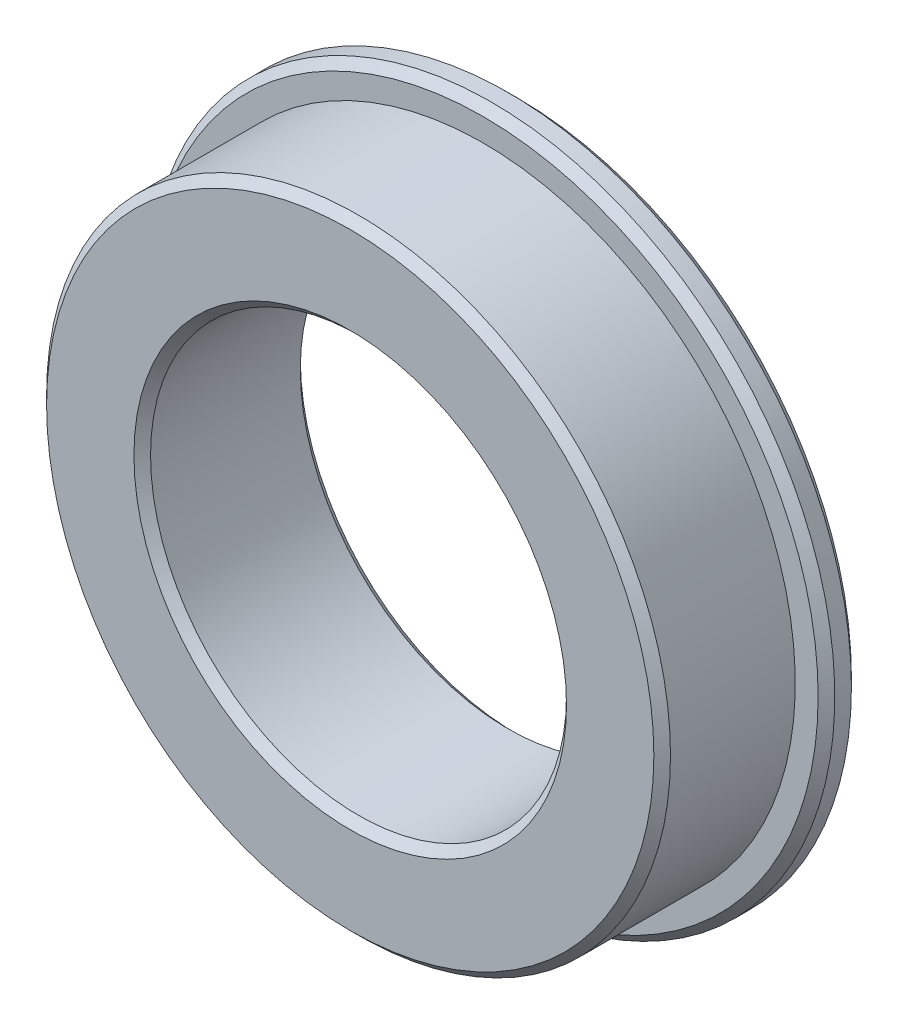
ISO-10303-21;
HEADER;
FILE_DESCRIPTION(('STEP AP214'),'2;1');
FILE_NAME('part.step','',(''),(''),'','','');
FILE_SCHEMA(('AUTOMOTIVE_DESIGN { 1 0 10303 214 1 1 1 1 }'));
ENDSEC;
DATA;
#1=APPLICATION_CONTEXT('core data for automotive mechanical design processes');
#2=APPLICATION_PROTOCOL_DEFINITION('international standard','automotive_design',2000,#1);
#3=PRODUCT_CONTEXT('',#1,'mechanical');
#4=PRODUCT('Part','Part','',(#3));
#5=PRODUCT_RELATED_PRODUCT_CATEGORY('part','',(#4));
#6=PRODUCT_DEFINITION_FORMATION('','',#4);
#7=PRODUCT_DEFINITION_CONTEXT('part definition',#1,'design');
#8=PRODUCT_DEFINITION('design','',#6,#7);
#9=PRODUCT_DEFINITION_SHAPE('','',#8);
#10=(LENGTH_UNIT() NAMED_UNIT(*) SI_UNIT(.MILLI.,.METRE.));
#11=(NAMED_UNIT(*) PLANE_ANGLE_UNIT() SI_UNIT($,.RADIAN.));
#12=(NAMED_UNIT(*) SI_UNIT($,.STERADIAN.) SOLID_ANGLE_UNIT());
#13=UNCERTAINTY_MEASURE_WITH_UNIT(LENGTH_MEASURE(1.E-05),#10,'distance_accuracy_value','');
#14=(GEOMETRIC_REPRESENTATION_CONTEXT(3) GLOBAL_UNCERTAINTY_ASSIGNED_CONTEXT((#13)) GLOBAL_UNIT_ASSIGNED_CONTEXT((#10,
#11,#12)) REPRESENTATION_CONTEXT('',''));
#15=CARTESIAN_POINT('',(0.,0.,0.));
#16=DIRECTION('',(0.,0.,1.));
#17=DIRECTION('',(1.,0.,0.));
#18=AXIS2_PLACEMENT_3D('',#15,#16,#17);
#19=CARTESIAN_POINT('',(0.,0.,4.));
#20=DIRECTION('',(0.,0.,-1.));
#21=DIRECTION('',(-1.,0.,0.));
#22=AXIS2_PLACEMENT_3D('',#19,#20,#21);
#23=CYLINDRICAL_SURFACE('',#22,7.5);
#24=CARTESIAN_POINT('',(0.,0.,3.8));
#25=DIRECTION('',(0.,0.,1.));
#26=DIRECTION('',(1.,0.,0.));
#27=AXIS2_PLACEMENT_3D('',#24,#25,#26);
#28=CIRCLE('',#27,7.5);
#29=CARTESIAN_POINT('',(7.5,0.,3.8));
#30=VERTEX_POINT('',#29);
#31=EDGE_CURVE('E41',#30,#30,#28,.F.);
#32=ORIENTED_EDGE('',*,*,#31,.T.);
#33=EDGE_LOOP('',(#32));
#34=FACE_BOUND('',#33,.T.);
#35=CARTESIAN_POINT('',(0.,0.,0.8));
#36=DIRECTION('',(0.,0.,-1.));
#37=DIRECTION('',(-1.,0.,0.));
#38=AXIS2_PLACEMENT_3D('',#35,#36,#37);
#39=CIRCLE('',#38,7.5);
#40=CARTESIAN_POINT('',(-7.5,0.,0.8));
#41=VERTEX_POINT('',#40);
#42=EDGE_CURVE('E72',#41,#41,#39,.T.);
#43=ORIENTED_EDGE('',*,*,#42,.F.);
#44=EDGE_LOOP('',(#43));
#45=FACE_BOUND('',#44,.T.);
#46=ADVANCED_FACE('F33',(#34,#45),#23,.T.);
#47=CARTESIAN_POINT('',(0.,0.,4.));
#48=DIRECTION('',(0.,0.,1.));
#49=DIRECTION('',(1.,0.,0.));
#50=AXIS2_PLACEMENT_3D('',#47,#48,#49);
#51=PLANE('',#50);
#52=CARTESIAN_POINT('',(0.,0.,4.));
#53=DIRECTION('',(0.,0.,1.));
#54=DIRECTION('',(1.,0.,0.));
#55=AXIS2_PLACEMENT_3D('',#52,#53,#54);
#56=CIRCLE('',#55,5.19999999999999);
#57=CARTESIAN_POINT('',(5.19999999999999,0.,4.));
#58=VERTEX_POINT('',#57);
#59=EDGE_CURVE('E60',#58,#58,#56,.F.);
#60=ORIENTED_EDGE('',*,*,#59,.T.);
#61=EDGE_LOOP('',(#60));
#62=FACE_BOUND('',#61,.T.);
#63=CARTESIAN_POINT('',(0.,0.,4.));
#64=DIRECTION('',(0.,0.,1.));
#65=DIRECTION('',(1.,0.,0.));
#66=AXIS2_PLACEMENT_3D('',#63,#64,#65);
#67=CIRCLE('',#66,7.3);
#68=CARTESIAN_POINT('',(7.3,0.,4.));
#69=VERTEX_POINT('',#68);
#70=EDGE_CURVE('E63',#69,#69,#67,.T.);
#71=ORIENTED_EDGE('',*,*,#70,.T.);
#72=EDGE_LOOP('',(#71));
#73=FACE_BOUND('',#72,.T.);
#74=ADVANCED_FACE('F79',(#62,#73),#51,.T.);
#75=CARTESIAN_POINT('',(0.,0.,0.));
#76=DIRECTION('',(0.,0.,1.));
#77=DIRECTION('',(1.,0.,0.));
#78=AXIS2_PLACEMENT_3D('',#75,#76,#77);
#79=PLANE('',#78);
#80=CARTESIAN_POINT('',(0.,0.,0.));
#81=DIRECTION('',(0.,0.,1.));
#82=DIRECTION('',(1.,0.,0.));
#83=AXIS2_PLACEMENT_3D('',#80,#81,#82);
#84=CIRCLE('',#83,5.19999999999999);
#85=CARTESIAN_POINT('',(-5.19999999999999,0.,0.));
#86=VERTEX_POINT('',#85);
#87=EDGE_CURVE('E54',#86,#86,#84,.T.);
#88=ORIENTED_EDGE('',*,*,#87,.T.);
#89=EDGE_LOOP('',(#88));
#90=FACE_BOUND('',#89,.T.);
#91=CARTESIAN_POINT('',(0.,0.,0.));
#92=DIRECTION('',(0.,0.,1.));
#93=DIRECTION('',(1.,0.,0.));
#94=AXIS2_PLACEMENT_3D('',#91,#92,#93);
#95=CIRCLE('',#94,8.05);
#96=CARTESIAN_POINT('',(8.05,0.,0.));
#97=VERTEX_POINT('',#96);
#98=EDGE_CURVE('E57',#97,#97,#95,.F.);
#99=ORIENTED_EDGE('',*,*,#98,.T.);
#100=EDGE_LOOP('',(#99));
#101=FACE_BOUND('',#100,.T.);
#102=ADVANCED_FACE('F84',(#90,#101),#79,.F.);
#103=CARTESIAN_POINT('',(0.,0.,4.));
#104=DIRECTION('',(0.,0.,-1.));
#105=DIRECTION('',(-1.,0.,0.));
#106=AXIS2_PLACEMENT_3D('',#103,#104,#105);
#107=CYLINDRICAL_SURFACE('',#106,5.);
#108=CARTESIAN_POINT('',(0.,0.,3.80000000000001));
#109=DIRECTION('',(0.,0.,1.));
#110=DIRECTION('',(1.,0.,0.));
#111=AXIS2_PLACEMENT_3D('',#108,#109,#110);
#112=CIRCLE('',#111,5.);
#113=CARTESIAN_POINT('',(5.,0.,3.80000000000001));
#114=VERTEX_POINT('',#113);
#115=EDGE_CURVE('E66',#114,#114,#112,.T.);
#116=ORIENTED_EDGE('',*,*,#115,.T.);
#117=EDGE_LOOP('',(#116));
#118=FACE_BOUND('',#117,.T.);
#119=CARTESIAN_POINT('',(0.,0.,0.199999999999994));
#120=DIRECTION('',(0.,0.,1.));
#121=DIRECTION('',(1.,0.,0.));
#122=AXIS2_PLACEMENT_3D('',#119,#120,#121);
#123=CIRCLE('',#122,5.);
#124=CARTESIAN_POINT('',(-5.,0.,0.199999999999994));
#125=VERTEX_POINT('',#124);
#126=EDGE_CURVE('E69',#125,#125,#123,.F.);
#127=ORIENTED_EDGE('',*,*,#126,.T.);
#128=EDGE_LOOP('',(#127));
#129=FACE_BOUND('',#128,.T.);
#130=ADVANCED_FACE('F129',(#118,#129),#107,.F.);
#131=CARTESIAN_POINT('',(0.,0.,0.8));
#132=DIRECTION('',(0.,0.,-1.));
#133=DIRECTION('',(-1.,0.,0.));
#134=AXIS2_PLACEMENT_3D('',#131,#132,#133);
#135=CYLINDRICAL_SURFACE('',#134,8.25);
#136=CARTESIAN_POINT('',(0.,0.,0.199999999999999));
#137=DIRECTION('',(0.,0.,1.));
#138=DIRECTION('',(1.,0.,0.));
#139=AXIS2_PLACEMENT_3D('',#136,#137,#138);
#140=CIRCLE('',#139,8.25);
#141=CARTESIAN_POINT('',(8.25,0.,0.199999999999999));
#142=VERTEX_POINT('',#141);
#143=EDGE_CURVE('E45',#142,#142,#140,.T.);
#144=ORIENTED_EDGE('',*,*,#143,.T.);
#145=EDGE_LOOP('',(#144));
#146=FACE_BOUND('',#145,.T.);
#147=CARTESIAN_POINT('',(0.,0.,0.6));
#148=DIRECTION('',(0.,0.,-1.));
#149=DIRECTION('',(-1.,0.,0.));
#150=AXIS2_PLACEMENT_3D('',#147,#148,#149);
#151=CIRCLE('',#150,8.25);
#152=CARTESIAN_POINT('',(-8.25,0.,0.6));
#153=VERTEX_POINT('',#152);
#154=EDGE_CURVE('E49',#153,#153,#151,.T.);
#155=ORIENTED_EDGE('',*,*,#154,.T.);
#156=EDGE_LOOP('',(#155));
#157=FACE_BOUND('',#156,.T.);
#158=ADVANCED_FACE('F127',(#146,#157),#135,.T.);
#159=CARTESIAN_POINT('',(0.,0.,0.8));
#160=DIRECTION('',(0.,0.,-1.));
#161=DIRECTION('',(-1.,0.,0.));
#162=AXIS2_PLACEMENT_3D('',#159,#160,#161);
#163=PLANE('',#162);
#164=CARTESIAN_POINT('',(0.,0.,0.8));
#165=DIRECTION('',(0.,0.,-1.));
#166=DIRECTION('',(-1.,0.,0.));
#167=AXIS2_PLACEMENT_3D('',#164,#165,#166);
#168=CIRCLE('',#167,8.05);
#169=CARTESIAN_POINT('',(-8.05,0.,0.8));
#170=VERTEX_POINT('',#169);
#171=EDGE_CURVE('E10',#170,#170,#168,.F.);
#172=ORIENTED_EDGE('',*,*,#171,.T.);
#173=EDGE_LOOP('',(#172));
#174=FACE_BOUND('',#173,.T.);
#175=ORIENTED_EDGE('',*,*,#42,.T.);
#176=EDGE_LOOP('',(#175));
#177=FACE_BOUND('',#176,.T.);
#178=ADVANCED_FACE('F76',(#174,#177),#163,.F.);
#179=CARTESIAN_POINT('',(0.,0.,3.80000000000001));
#180=DIRECTION('',(0.,0.,1.));
#181=DIRECTION('',(1.,0.,0.));
#182=AXIS2_PLACEMENT_3D('',#179,#180,#181);
#183=CONICAL_SURFACE('',#182,5.,0.78539816339745);
#184=ORIENTED_EDGE('',*,*,#59,.F.);
#185=EDGE_LOOP('',(#184));
#186=FACE_BOUND('',#185,.T.);
#187=ORIENTED_EDGE('',*,*,#115,.F.);
#188=EDGE_LOOP('',(#187));
#189=FACE_BOUND('',#188,.T.);
#190=ADVANCED_FACE('F90',(#186,#189),#183,.F.);
#191=CARTESIAN_POINT('',(0.,0.,0.));
#192=DIRECTION('',(0.,0.,-1.));
#193=DIRECTION('',(-1.,0.,0.));
#194=AXIS2_PLACEMENT_3D('',#191,#192,#193);
#195=CONICAL_SURFACE('',#194,5.19999999999999,0.785398163397446);
#196=CARTESIAN_POINT('',(-5.,0.,0.199999999999994));
#197=CARTESIAN_POINT('',(-5.00208333333333,0.,0.197916666666661));
#198=CARTESIAN_POINT('',(-5.00416666666667,0.,0.195833333333327));
#199=CARTESIAN_POINT('',(-5.00833333333333,0.,0.19166666666666));
#200=CARTESIAN_POINT('',(-5.01041666666667,0.,0.189583333333327));
#201=CARTESIAN_POINT('',(-5.01458333333333,0.,0.185416666666661));
#202=CARTESIAN_POINT('',(-5.01666666666667,0.,0.183333333333328));
#203=CARTESIAN_POINT('',(-5.02083333333333,0.,0.179166666666661));
#204=CARTESIAN_POINT('',(-5.02291666666667,0.,0.177083333333328));
#205=CARTESIAN_POINT('',(-5.02708333333333,0.,0.172916666666661));
#206=CARTESIAN_POINT('',(-5.02916666666667,0.,0.170833333333328));
#207=CARTESIAN_POINT('',(-5.03333333333333,0.,0.166666666666661));
#208=CARTESIAN_POINT('',(-5.03541666666667,0.,0.164583333333328));
#209=CARTESIAN_POINT('',(-5.03958333333333,0.,0.160416666666661));
#210=CARTESIAN_POINT('',(-5.04166666666667,0.,0.158333333333328));
#211=CARTESIAN_POINT('',(-5.04583333333333,0.,0.154166666666662));
#212=CARTESIAN_POINT('',(-5.04791666666666,0.,0.152083333333328));
#213=CARTESIAN_POINT('',(-5.05208333333333,0.,0.147916666666662));
#214=CARTESIAN_POINT('',(-5.05416666666667,0.,0.145833333333329));
#215=CARTESIAN_POINT('',(-5.05833333333333,0.,0.141666666666662));
#216=CARTESIAN_POINT('',(-5.06041666666666,0.,0.139583333333329));
#217=CARTESIAN_POINT('',(-5.06458333333333,0.,0.135416666666662));
#218=CARTESIAN_POINT('',(-5.06666666666666,0.,0.133333333333329));
#219=CARTESIAN_POINT('',(-5.07083333333333,0.,0.129166666666663));
#220=CARTESIAN_POINT('',(-5.07291666666666,0.,0.127083333333329));
#221=CARTESIAN_POINT('',(-5.07708333333333,0.,0.122916666666663));
#222=CARTESIAN_POINT('',(-5.07916666666666,0.,0.12083333333333));
#223=CARTESIAN_POINT('',(-5.08333333333333,0.,0.116666666666663));
#224=CARTESIAN_POINT('',(-5.08541666666666,0.,0.11458333333333));
#225=CARTESIAN_POINT('',(-5.08958333333333,0.,0.110416666666663));
#226=CARTESIAN_POINT('',(-5.09166666666666,0.,0.10833333333333));
#227=CARTESIAN_POINT('',(-5.09583333333333,0.,0.104166666666663));
#228=CARTESIAN_POINT('',(-5.09791666666666,0.,0.10208333333333));
#229=CARTESIAN_POINT('',(-5.10208333333333,0.,0.0979166666666636));
#230=CARTESIAN_POINT('',(-5.10416666666666,0.,0.0958333333333302));
#231=CARTESIAN_POINT('',(-5.10833333333333,0.,0.0916666666666636));
#232=CARTESIAN_POINT('',(-5.11041666666666,0.,0.0895833333333305));
#233=CARTESIAN_POINT('',(-5.11458333333333,0.,0.085416666666664));
#234=CARTESIAN_POINT('',(-5.11666666666666,0.,0.0833333333333306));
#235=CARTESIAN_POINT('',(-5.12083333333333,0.,0.079166666666664));
#236=CARTESIAN_POINT('',(-5.12291666666666,0.,0.0770833333333309));
#237=CARTESIAN_POINT('',(-5.12708333333333,0.,0.0729166666666644));
#238=CARTESIAN_POINT('',(-5.12916666666666,0.,0.070833333333331));
#239=CARTESIAN_POINT('',(-5.13333333333333,0.,0.0666666666666644));
#240=CARTESIAN_POINT('',(-5.13541666666666,0.,0.0645833333333313));
#241=CARTESIAN_POINT('',(-5.13958333333333,0.,0.0604166666666648));
#242=CARTESIAN_POINT('',(-5.14166666666666,0.,0.0583333333333314));
#243=CARTESIAN_POINT('',(-5.14583333333333,0.,0.0541666666666649));
#244=CARTESIAN_POINT('',(-5.14791666666666,0.,0.0520833333333317));
#245=CARTESIAN_POINT('',(-5.15208333333333,0.,0.0479166666666652));
#246=CARTESIAN_POINT('',(-5.15416666666666,0.,0.0458333333333318));
#247=CARTESIAN_POINT('',(-5.15833333333333,0.,0.0416666666666652));
#248=CARTESIAN_POINT('',(-5.16041666666666,0.,0.0395833333333321));
#249=CARTESIAN_POINT('',(-5.16458333333333,0.,0.0354166666666656));
#250=CARTESIAN_POINT('',(-5.16666666666666,0.,0.0333333333333322));
#251=CARTESIAN_POINT('',(-5.17083333333333,0.,0.0291666666666657));
#252=CARTESIAN_POINT('',(-5.17291666666666,0.,0.0270833333333325));
#253=CARTESIAN_POINT('',(-5.17708333333333,0.,0.022916666666666));
#254=CARTESIAN_POINT('',(-5.17916666666666,0.,0.0208333333333326));
#255=CARTESIAN_POINT('',(-5.18333333333333,0.,0.0166666666666661));
#256=CARTESIAN_POINT('',(-5.18541666666666,0.,0.0145833333333329));
#257=CARTESIAN_POINT('',(-5.18958333333333,0.,0.0104166666666664));
#258=CARTESIAN_POINT('',(-5.19166666666666,0.,0.00833333333333308));
#259=CARTESIAN_POINT('',(-5.19583333333333,0.,0.00416666666666638));
#260=CARTESIAN_POINT('',(-5.19791666666666,0.,0.00208333333333303));
#261=CARTESIAN_POINT('',(-5.19999999999999,0.,0.));
#262=B_SPLINE_CURVE_WITH_KNOTS('',3,(#196,#197,#198,#199,#200,#201,#202,#203,#204,#205,#206,
#207,#208,#209,#210,#211,#212,#213,#214,#215,#216,#217,#218,#219,#220,#221,#222,#223,#224,#225,
#226,#227,#228,#229,#230,#231,#232,#233,#234,#235,#236,#237,#238,#239,#240,#241,#242,#243,#244,
#245,#246,#247,#248,#249,#250,#251,#252,#253,#254,#255,#256,#257,#258,#259,#260,#261),
.UNSPECIFIED.,.F.,.F.,(4,2,2,2,2,2,2,2,2,2,2,2,2,2,2,2,2,2,2,2,2,2,2,2,2,2,2,2,2,2,2,2,4),(0.,
0.00883883476483183,0.017677669529663,0.0265165042944949,0.0353553390593261,0.0441941738241579,
0.0530330085889891,0.061871843353821,0.0707106781186522,0.079549512883484,0.0883883476483152,
0.0972271824131471,0.106066017177978,0.11490485194281,0.123743686707641,0.132582521472473,
0.141421356237305,0.150260191002136,0.159099025766968,0.167937860531799,0.176776695296631,
0.185615530061462,0.194454364826294,0.203293199591125,0.212132034355957,0.220970869120788,
0.22980970388562,0.238648538650451,0.247487373415283,0.256326208180114,0.265165042944946,
0.274003877709777,0.282842712474609),.UNSPECIFIED.);
#263=EDGE_CURVE('BSEAM96',#125,#86,#262,.T.);
#264=ORIENTED_EDGE('',*,*,#126,.F.);
#265=ORIENTED_EDGE('',*,*,#87,.F.);
#266=ORIENTED_EDGE('',*,*,#263,.T.);
#267=ORIENTED_EDGE('',*,*,#263,.F.);
#268=EDGE_LOOP('',(#264,#266,#265,#267));
#269=FACE_BOUND('',#268,.T.);
#270=ADVANCED_FACE('F96',(#269),#195,.F.);
#271=CARTESIAN_POINT('',(0.,0.,0.));
#272=DIRECTION('',(0.,0.,1.));
#273=DIRECTION('',(1.,0.,0.));
#274=AXIS2_PLACEMENT_3D('',#271,#272,#273);
#275=CONICAL_SURFACE('',#274,8.05,0.785398163397448);
#276=ORIENTED_EDGE('',*,*,#143,.F.);
#277=EDGE_LOOP('',(#276));
#278=FACE_BOUND('',#277,.T.);
#279=ORIENTED_EDGE('',*,*,#98,.F.);
#280=EDGE_LOOP('',(#279));
#281=FACE_BOUND('',#280,.T.);
#282=ADVANCED_FACE('F103',(#278,#281),#275,.T.);
#283=CARTESIAN_POINT('',(0.,0.,4.));
#284=DIRECTION('',(0.,0.,-1.));
#285=DIRECTION('',(-1.,0.,0.));
#286=AXIS2_PLACEMENT_3D('',#283,#284,#285);
#287=CONICAL_SURFACE('',#286,7.3,0.785398163397444);
#288=ORIENTED_EDGE('',*,*,#31,.F.);
#289=EDGE_LOOP('',(#288));
#290=FACE_BOUND('',#289,.T.);
#291=ORIENTED_EDGE('',*,*,#70,.F.);
#292=EDGE_LOOP('',(#291));
#293=FACE_BOUND('',#292,.T.);
#294=ADVANCED_FACE('F109',(#290,#293),#287,.T.);
#295=CARTESIAN_POINT('',(0.,0.,0.6));
#296=DIRECTION('',(0.,0.,-1.));
#297=DIRECTION('',(-1.,0.,0.));
#298=AXIS2_PLACEMENT_3D('',#295,#296,#297);
#299=CONICAL_SURFACE('',#298,8.25,0.785398163397453);
#300=ORIENTED_EDGE('',*,*,#171,.F.);
#301=EDGE_LOOP('',(#300));
#302=FACE_BOUND('',#301,.T.);
#303=ORIENTED_EDGE('',*,*,#154,.F.);
#304=EDGE_LOOP('',(#303));
#305=FACE_BOUND('',#304,.T.);
#306=ADVANCED_FACE('F36',(#302,#305),#299,.T.);
#307=CLOSED_SHELL('',(#46,#74,#102,#130,#158,#178,#190,#270,#282,#294,#306));
#308=MANIFOLD_SOLID_BREP('B2',#307);
#309=ADVANCED_BREP_SHAPE_REPRESENTATION('',(#18,#308),#14);
#310=SHAPE_DEFINITION_REPRESENTATION(#9,#309);
ENDSEC;
END-ISO-10303-21;
